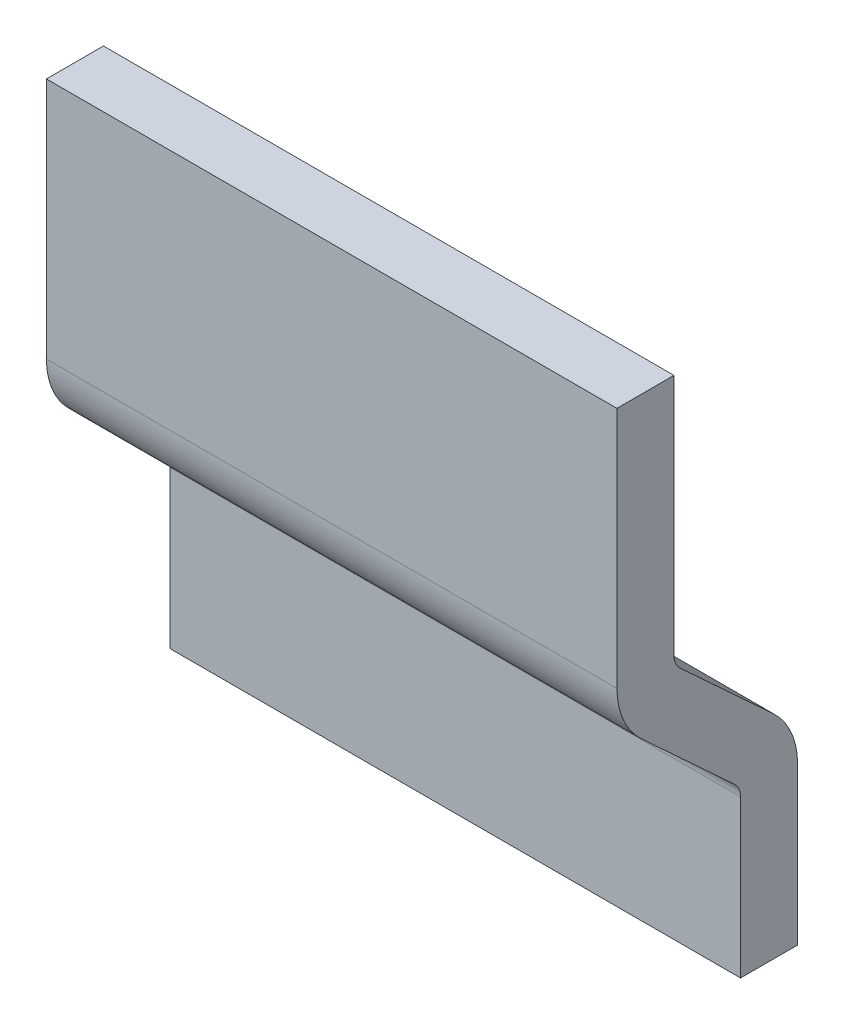
ISO-10303-21;
HEADER;
FILE_DESCRIPTION(('STEP AP214'),'2;1');
FILE_NAME('part.step','',(''),(''),'','','');
FILE_SCHEMA(('AUTOMOTIVE_DESIGN { 1 0 10303 214 1 1 1 1 }'));
ENDSEC;
DATA;
#1=APPLICATION_CONTEXT('core data for automotive mechanical design processes');
#2=APPLICATION_PROTOCOL_DEFINITION('international standard','automotive_design',2000,#1);
#3=PRODUCT_CONTEXT('',#1,'mechanical');
#4=PRODUCT('Part','Part','',(#3));
#5=PRODUCT_RELATED_PRODUCT_CATEGORY('part','',(#4));
#6=PRODUCT_DEFINITION_FORMATION('','',#4);
#7=PRODUCT_DEFINITION_CONTEXT('part definition',#1,'design');
#8=PRODUCT_DEFINITION('design','',#6,#7);
#9=PRODUCT_DEFINITION_SHAPE('','',#8);
#10=(LENGTH_UNIT() NAMED_UNIT(*) SI_UNIT(.MILLI.,.METRE.));
#11=(NAMED_UNIT(*) PLANE_ANGLE_UNIT() SI_UNIT($,.RADIAN.));
#12=(NAMED_UNIT(*) SI_UNIT($,.STERADIAN.) SOLID_ANGLE_UNIT());
#13=UNCERTAINTY_MEASURE_WITH_UNIT(LENGTH_MEASURE(1.E-05),#10,'distance_accuracy_value','');
#14=(GEOMETRIC_REPRESENTATION_CONTEXT(3) GLOBAL_UNCERTAINTY_ASSIGNED_CONTEXT((#13)) GLOBAL_UNIT_ASSIGNED_CONTEXT((#10,
#11,#12)) REPRESENTATION_CONTEXT('',''));
#15=CARTESIAN_POINT('',(0.,0.,0.));
#16=DIRECTION('',(0.,0.,1.));
#17=DIRECTION('',(1.,0.,0.));
#18=AXIS2_PLACEMENT_3D('',#15,#16,#17);
#19=CARTESIAN_POINT('',(-1.5,-3.5,0.3));
#20=DIRECTION('',(0.,0.,1.));
#21=DIRECTION('',(0.,-1.,0.));
#22=AXIS2_PLACEMENT_3D('',#19,#20,#21);
#23=PLANE('',#22);
#24=DIRECTION('',(0.,-1.,0.));
#25=VECTOR('',#24,1.);
#26=CARTESIAN_POINT('',(1.5,-3.5,0.3));
#27=LINE('',#26,#25);
#28=CARTESIAN_POINT('',(1.5,-3.5,0.3));
#29=VERTEX_POINT('',#28);
#30=CARTESIAN_POINT('',(1.5,-2.675132492706,0.3));
#31=VERTEX_POINT('',#30);
#32=EDGE_CURVE('E102',#29,#31,#27,.F.);
#33=ORIENTED_EDGE('',*,*,#32,.T.);
#34=DIRECTION('',(1.,0.,0.));
#35=VECTOR('',#34,1.);
#36=CARTESIAN_POINT('',(-1.5,-2.675132492706,0.3));
#37=LINE('',#36,#35);
#38=CARTESIAN_POINT('',(-1.5,-2.675132492706,0.3));
#39=VERTEX_POINT('',#38);
#40=EDGE_CURVE('E106',#31,#39,#37,.F.);
#41=ORIENTED_EDGE('',*,*,#40,.T.);
#42=DIRECTION('',(0.,-1.,0.));
#43=VECTOR('',#42,1.);
#44=CARTESIAN_POINT('',(-1.5,-3.5,0.3));
#45=LINE('',#44,#43);
#46=CARTESIAN_POINT('',(-1.5,-3.5,0.3));
#47=VERTEX_POINT('',#46);
#48=EDGE_CURVE('E90',#39,#47,#45,.T.);
#49=ORIENTED_EDGE('',*,*,#48,.T.);
#50=DIRECTION('',(1.,0.,0.));
#51=VECTOR('',#50,1.);
#52=CARTESIAN_POINT('',(-1.5,-3.5,0.3));
#53=LINE('',#52,#51);
#54=EDGE_CURVE('E162',#29,#47,#53,.F.);
#55=ORIENTED_EDGE('',*,*,#54,.F.);
#56=EDGE_LOOP('',(#33,#41,#49,#55));
#57=FACE_BOUND('',#56,.T.);
#58=ADVANCED_FACE('F17',(#57),#23,.T.);
#59=CARTESIAN_POINT('',(-1.5,-2.675132492706,0.4));
#60=DIRECTION('',(1.,0.,0.));
#61=DIRECTION('',(0.,1.,0.));
#62=AXIS2_PLACEMENT_3D('',#59,#60,#61);
#63=CYLINDRICAL_SURFACE('',#62,0.1);
#64=CARTESIAN_POINT('',(1.5,-2.675132492706,0.4));
#65=DIRECTION('',(1.,0.,0.));
#66=DIRECTION('',(0.,1.,0.));
#67=AXIS2_PLACEMENT_3D('',#64,#65,#66);
#68=CIRCLE('',#67,0.1);
#69=CARTESIAN_POINT('',(1.5,-2.60165214824366,0.332171989726855));
#70=VERTEX_POINT('',#69);
#71=EDGE_CURVE('E110',#70,#31,#68,.F.);
#72=ORIENTED_EDGE('',*,*,#71,.F.);
#73=DIRECTION('',(1.,0.,0.));
#74=VECTOR('',#73,1.);
#75=CARTESIAN_POINT('',(-1.5,-2.60165214824374,0.332171989726762));
#76=LINE('',#75,#74);
#77=CARTESIAN_POINT('',(-1.5,-2.60165214824366,0.332171989726855));
#78=VERTEX_POINT('',#77);
#79=EDGE_CURVE('E114',#78,#70,#76,.T.);
#80=ORIENTED_EDGE('',*,*,#79,.F.);
#81=CARTESIAN_POINT('',(-1.5,-2.675132492706,0.4));
#82=DIRECTION('',(1.,0.,0.));
#83=DIRECTION('',(0.,1.,0.));
#84=AXIS2_PLACEMENT_3D('',#81,#82,#83);
#85=CIRCLE('',#84,0.1);
#86=EDGE_CURVE('E20',#39,#78,#85,.T.);
#87=ORIENTED_EDGE('',*,*,#86,.F.);
#88=ORIENTED_EDGE('',*,*,#40,.F.);
#89=EDGE_LOOP('',(#72,#80,#87,#88));
#90=FACE_BOUND('',#89,.T.);
#91=ADVANCED_FACE('F112',(#90),#63,.F.);
#92=CARTESIAN_POINT('',(-1.5,-3.5,0.));
#93=DIRECTION('',(0.,-1.,0.));
#94=DIRECTION('',(1.,0.,0.));
#95=AXIS2_PLACEMENT_3D('',#92,#93,#94);
#96=PLANE('',#95);
#97=ORIENTED_EDGE('',*,*,#54,.T.);
#98=DIRECTION('',(0.,0.,1.));
#99=VECTOR('',#98,1.);
#100=CARTESIAN_POINT('',(-1.5,-3.5,0.));
#101=LINE('',#100,#99);
#102=CARTESIAN_POINT('',(-1.5,-3.5,0.));
#103=VERTEX_POINT('',#102);
#104=EDGE_CURVE('E98',#47,#103,#101,.F.);
#105=ORIENTED_EDGE('',*,*,#104,.T.);
#106=DIRECTION('',(1.,0.,0.));
#107=VECTOR('',#106,1.);
#108=CARTESIAN_POINT('',(-1.5,-3.5,0.));
#109=LINE('',#108,#107);
#110=CARTESIAN_POINT('',(1.5,-3.5,0.));
#111=VERTEX_POINT('',#110);
#112=EDGE_CURVE('E141',#111,#103,#109,.F.);
#113=ORIENTED_EDGE('',*,*,#112,.F.);
#114=DIRECTION('',(0.,0.,1.));
#115=VECTOR('',#114,1.);
#116=CARTESIAN_POINT('',(1.5,-3.5,0.));
#117=LINE('',#116,#115);
#118=EDGE_CURVE('E109',#111,#29,#117,.T.);
#119=ORIENTED_EDGE('',*,*,#118,.T.);
#120=EDGE_LOOP('',(#97,#105,#113,#119));
#121=FACE_BOUND('',#120,.T.);
#122=ADVANCED_FACE('F173',(#121),#96,.T.);
#123=CARTESIAN_POINT('',(-1.5,-2.63134936953,0.3));
#124=DIRECTION('',(0.,-0.734803444627296,0.678280102733274));
#125=DIRECTION('',(0.,-0.678280102733274,-0.734803444627296));
#126=AXIS2_PLACEMENT_3D('',#123,#124,#125);
#127=PLANE('',#126);
#128=DIRECTION('',(0.,-0.678280102733274,-0.734803444627296));
#129=VECTOR('',#128,1.);
#130=CARTESIAN_POINT('',(1.5,-2.63134936953,0.3));
#131=LINE('',#130,#129);
#132=CARTESIAN_POINT('',(1.5,-2.15013825467414,0.821312041093317));
#133=VERTEX_POINT('',#132);
#134=EDGE_CURVE('E169',#70,#133,#131,.F.);
#135=ORIENTED_EDGE('',*,*,#134,.T.);
#136=DIRECTION('',(1.,0.,0.));
#137=VECTOR('',#136,1.);
#138=CARTESIAN_POINT('',(-1.5,-2.15013825467411,0.821312041093102));
#139=LINE('',#138,#137);
#140=CARTESIAN_POINT('',(-1.5,-2.15013825467414,0.821312041093317));
#141=VERTEX_POINT('',#140);
#142=EDGE_CURVE('E138',#141,#133,#139,.T.);
#143=ORIENTED_EDGE('',*,*,#142,.F.);
#144=DIRECTION('',(0.,-0.678280102733274,-0.734803444627296));
#145=VECTOR('',#144,1.);
#146=CARTESIAN_POINT('',(-1.5,-2.63134936953,0.3));
#147=LINE('',#146,#145);
#148=EDGE_CURVE('E156',#141,#78,#147,.T.);
#149=ORIENTED_EDGE('',*,*,#148,.T.);
#150=ORIENTED_EDGE('',*,*,#79,.T.);
#151=EDGE_LOOP('',(#135,#143,#149,#150));
#152=FACE_BOUND('',#151,.T.);
#153=ADVANCED_FACE('F240',(#152),#127,.T.);
#154=CARTESIAN_POINT('',(-1.5,-2.5,0.));
#155=DIRECTION('',(0.,0.,-1.));
#156=DIRECTION('',(0.,1.,0.));
#157=AXIS2_PLACEMENT_3D('',#154,#155,#156);
#158=PLANE('',#157);
#159=DIRECTION('',(0.,1.,0.));
#160=VECTOR('',#159,1.);
#161=CARTESIAN_POINT('',(1.5,-2.5,0.));
#162=LINE('',#161,#160);
#163=CARTESIAN_POINT('',(1.5,-2.675132492706,0.));
#164=VERTEX_POINT('',#163);
#165=EDGE_CURVE('E147',#164,#111,#162,.F.);
#166=ORIENTED_EDGE('',*,*,#165,.T.);
#167=ORIENTED_EDGE('',*,*,#112,.T.);
#168=DIRECTION('',(0.,1.,0.));
#169=VECTOR('',#168,1.);
#170=CARTESIAN_POINT('',(-1.5,-2.5,0.));
#171=LINE('',#170,#169);
#172=CARTESIAN_POINT('',(-1.5,-2.675132492706,0.));
#173=VERTEX_POINT('',#172);
#174=EDGE_CURVE('E152',#103,#173,#171,.T.);
#175=ORIENTED_EDGE('',*,*,#174,.T.);
#176=DIRECTION('',(1.,0.,0.));
#177=VECTOR('',#176,1.);
#178=CARTESIAN_POINT('',(-1.5,-2.675132492706,0.));
#179=LINE('',#178,#177);
#180=EDGE_CURVE('E132',#164,#173,#179,.F.);
#181=ORIENTED_EDGE('',*,*,#180,.F.);
#182=EDGE_LOOP('',(#166,#167,#175,#181));
#183=FACE_BOUND('',#182,.T.);
#184=ADVANCED_FACE('F246',(#183),#158,.T.);
#185=CARTESIAN_POINT('',(-1.5,-1.856216876823,0.55));
#186=DIRECTION('',(1.,0.,0.));
#187=DIRECTION('',(0.,1.,0.));
#188=AXIS2_PLACEMENT_3D('',#185,#186,#187);
#189=CYLINDRICAL_SURFACE('',#188,0.4);
#190=CARTESIAN_POINT('',(1.5,-1.856216876823,0.55));
#191=DIRECTION('',(1.,0.,0.));
#192=DIRECTION('',(0.,1.,0.));
#193=AXIS2_PLACEMENT_3D('',#190,#191,#192);
#194=CIRCLE('',#193,0.4);
#195=CARTESIAN_POINT('',(1.5,-1.856216876823,0.95));
#196=VERTEX_POINT('',#195);
#197=EDGE_CURVE('E136',#133,#196,#194,.F.);
#198=ORIENTED_EDGE('',*,*,#197,.T.);
#199=DIRECTION('',(1.,0.,0.));
#200=VECTOR('',#199,1.);
#201=CARTESIAN_POINT('',(-1.5,-1.856216876823,0.95));
#202=LINE('',#201,#200);
#203=CARTESIAN_POINT('',(-1.5,-1.856216876823,0.95));
#204=VERTEX_POINT('',#203);
#205=EDGE_CURVE('E131',#204,#196,#202,.T.);
#206=ORIENTED_EDGE('',*,*,#205,.F.);
#207=CARTESIAN_POINT('',(-1.5,-1.856216876823,0.55));
#208=DIRECTION('',(1.,0.,0.));
#209=DIRECTION('',(0.,1.,0.));
#210=AXIS2_PLACEMENT_3D('',#207,#208,#209);
#211=CIRCLE('',#210,0.4);
#212=EDGE_CURVE('E139',#204,#141,#211,.T.);
#213=ORIENTED_EDGE('',*,*,#212,.T.);
#214=ORIENTED_EDGE('',*,*,#142,.T.);
#215=EDGE_LOOP('',(#198,#206,#213,#214));
#216=FACE_BOUND('',#215,.T.);
#217=ADVANCED_FACE('F243',(#216),#189,.T.);
#218=CARTESIAN_POINT('',(-1.5,-2.675132492706,0.4));
#219=DIRECTION('',(1.,0.,0.));
#220=DIRECTION('',(0.,1.,0.));
#221=AXIS2_PLACEMENT_3D('',#218,#219,#220);
#222=CYLINDRICAL_SURFACE('',#221,0.4);
#223=ORIENTED_EDGE('',*,*,#180,.T.);
#224=CARTESIAN_POINT('',(-1.5,-2.675132492706,0.4));
#225=DIRECTION('',(1.,0.,0.));
#226=DIRECTION('',(0.,1.,0.));
#227=AXIS2_PLACEMENT_3D('',#224,#225,#226);
#228=CIRCLE('',#227,0.4);
#229=CARTESIAN_POINT('',(-1.5,-2.38121111485521,0.128687958906962));
#230=VERTEX_POINT('',#229);
#231=EDGE_CURVE('E129',#173,#230,#228,.T.);
#232=ORIENTED_EDGE('',*,*,#231,.T.);
#233=DIRECTION('',(1.,0.,0.));
#234=VECTOR('',#233,1.);
#235=CARTESIAN_POINT('',(-1.5,-2.38121111485519,0.128687958907174));
#236=LINE('',#235,#234);
#237=CARTESIAN_POINT('',(1.5,-2.38121111485521,0.128687958906962));
#238=VERTEX_POINT('',#237);
#239=EDGE_CURVE('E216',#238,#230,#236,.F.);
#240=ORIENTED_EDGE('',*,*,#239,.F.);
#241=CARTESIAN_POINT('',(1.5,-2.675132492706,0.4));
#242=DIRECTION('',(1.,0.,0.));
#243=DIRECTION('',(0.,1.,0.));
#244=AXIS2_PLACEMENT_3D('',#241,#242,#243);
#245=CIRCLE('',#244,0.4);
#246=EDGE_CURVE('E133',#238,#164,#245,.F.);
#247=ORIENTED_EDGE('',*,*,#246,.T.);
#248=EDGE_LOOP('',(#223,#232,#240,#247));
#249=FACE_BOUND('',#248,.T.);
#250=ADVANCED_FACE('F245',(#249),#222,.T.);
#251=CARTESIAN_POINT('',(-1.5,-2.03134936953,0.95));
#252=DIRECTION('',(0.,0.,1.));
#253=DIRECTION('',(0.,-1.,0.));
#254=AXIS2_PLACEMENT_3D('',#251,#252,#253);
#255=PLANE('',#254);
#256=DIRECTION('',(0.,-1.,0.));
#257=VECTOR('',#256,1.);
#258=CARTESIAN_POINT('',(1.5,-2.03134936953,0.95));
#259=LINE('',#258,#257);
#260=CARTESIAN_POINT('',(1.5,-0.580679000001,0.95));
#261=VERTEX_POINT('',#260);
#262=EDGE_CURVE('E224',#196,#261,#259,.F.);
#263=ORIENTED_EDGE('',*,*,#262,.T.);
#264=DIRECTION('',(-1.,0.,0.));
#265=VECTOR('',#264,1.);
#266=CARTESIAN_POINT('',(-1.5,-0.580679000001,0.95));
#267=LINE('',#266,#265);
#268=CARTESIAN_POINT('',(-1.5,-0.580679000001,0.95));
#269=VERTEX_POINT('',#268);
#270=EDGE_CURVE('E195',#269,#261,#267,.F.);
#271=ORIENTED_EDGE('',*,*,#270,.F.);
#272=DIRECTION('',(0.,1.,0.));
#273=VECTOR('',#272,1.);
#274=CARTESIAN_POINT('',(-1.5,-2.058641392508,0.95));
#275=LINE('',#274,#273);
#276=EDGE_CURVE('E191',#269,#204,#275,.F.);
#277=ORIENTED_EDGE('',*,*,#276,.T.);
#278=ORIENTED_EDGE('',*,*,#205,.T.);
#279=EDGE_LOOP('',(#263,#271,#277,#278));
#280=FACE_BOUND('',#279,.T.);
#281=ADVANCED_FACE('F253',(#280),#255,.T.);
#282=CARTESIAN_POINT('',(-1.5,-1.9,0.65));
#283=DIRECTION('',(0.,0.734803444627296,-0.678280102733274));
#284=DIRECTION('',(0.,0.678280102733274,0.734803444627296));
#285=AXIS2_PLACEMENT_3D('',#282,#283,#284);
#286=PLANE('',#285);
#287=DIRECTION('',(0.,0.678280102733378,0.7348034446272));
#288=VECTOR('',#287,1.);
#289=CARTESIAN_POINT('',(1.5,-2.381211114855,0.128687958907));
#290=LINE('',#289,#288);
#291=CARTESIAN_POINT('',(1.5,-1.92969722128586,0.617828010273169));
#292=VERTEX_POINT('',#291);
#293=EDGE_CURVE('E194',#238,#292,#290,.T.);
#294=ORIENTED_EDGE('',*,*,#293,.F.);
#295=ORIENTED_EDGE('',*,*,#239,.T.);
#296=DIRECTION('',(0.,0.678280102733378,0.7348034446272));
#297=VECTOR('',#296,1.);
#298=CARTESIAN_POINT('',(-1.5,-2.381211114855,0.128687958907));
#299=LINE('',#298,#297);
#300=CARTESIAN_POINT('',(-1.5,-1.92969722128586,0.617828010273169));
#301=VERTEX_POINT('',#300);
#302=EDGE_CURVE('E212',#230,#301,#299,.T.);
#303=ORIENTED_EDGE('',*,*,#302,.T.);
#304=DIRECTION('',(1.,0.,0.));
#305=VECTOR('',#304,1.);
#306=CARTESIAN_POINT('',(-1.5,-1.92969722128602,0.617828010273016));
#307=LINE('',#306,#305);
#308=EDGE_CURVE('E124',#301,#292,#307,.T.);
#309=ORIENTED_EDGE('',*,*,#308,.T.);
#310=EDGE_LOOP('',(#294,#295,#303,#309));
#311=FACE_BOUND('',#310,.T.);
#312=ADVANCED_FACE('F272',(#311),#286,.T.);
#313=CARTESIAN_POINT('',(-1.5,-2.058641392508,0.516801249384));
#314=DIRECTION('',(1.,0.,0.));
#315=DIRECTION('',(0.,1.,0.));
#316=AXIS2_PLACEMENT_3D('',#313,#314,#315);
#317=PLANE('',#316);
#318=ORIENTED_EDGE('',*,*,#174,.F.);
#319=ORIENTED_EDGE('',*,*,#104,.F.);
#320=ORIENTED_EDGE('',*,*,#48,.F.);
#321=ORIENTED_EDGE('',*,*,#86,.T.);
#322=ORIENTED_EDGE('',*,*,#148,.F.);
#323=ORIENTED_EDGE('',*,*,#212,.F.);
#324=ORIENTED_EDGE('',*,*,#276,.F.);
#325=DIRECTION('',(0.,0.,1.));
#326=VECTOR('',#325,1.);
#327=CARTESIAN_POINT('',(-1.5,-0.580679000001,0.95));
#328=LINE('',#327,#326);
#329=CARTESIAN_POINT('',(-1.5,-0.580679000001,0.65));
#330=VERTEX_POINT('',#329);
#331=EDGE_CURVE('E186',#330,#269,#328,.T.);
#332=ORIENTED_EDGE('',*,*,#331,.F.);
#333=DIRECTION('',(0.,1.,0.));
#334=VECTOR('',#333,1.);
#335=CARTESIAN_POINT('',(-1.5,-0.580679000001,0.65));
#336=LINE('',#335,#334);
#337=CARTESIAN_POINT('',(-1.5,-1.856216876823,0.65));
#338=VERTEX_POINT('',#337);
#339=EDGE_CURVE('E123',#338,#330,#336,.T.);
#340=ORIENTED_EDGE('',*,*,#339,.F.);
#341=CARTESIAN_POINT('',(-1.5,-1.856216876823,0.55));
#342=DIRECTION('',(1.,0.,0.));
#343=DIRECTION('',(0.,1.,0.));
#344=AXIS2_PLACEMENT_3D('',#341,#342,#343);
#345=CIRCLE('',#344,0.1);
#346=EDGE_CURVE('E125',#338,#301,#345,.T.);
#347=ORIENTED_EDGE('',*,*,#346,.T.);
#348=ORIENTED_EDGE('',*,*,#302,.F.);
#349=ORIENTED_EDGE('',*,*,#231,.F.);
#350=EDGE_LOOP('',(#318,#319,#320,#321,#322,#323,#324,#332,#340,#347,#348,#349));
#351=FACE_BOUND('',#350,.T.);
#352=ADVANCED_FACE('F93',(#351),#317,.F.);
#353=CARTESIAN_POINT('',(-1.5,-0.580679000001,0.95));
#354=DIRECTION('',(0.,1.,0.));
#355=DIRECTION('',(-1.,0.,0.));
#356=AXIS2_PLACEMENT_3D('',#353,#354,#355);
#357=PLANE('',#356);
#358=DIRECTION('',(1.,0.,0.));
#359=VECTOR('',#358,1.);
#360=CARTESIAN_POINT('',(-1.5,-0.580679000001,0.65));
#361=LINE('',#360,#359);
#362=CARTESIAN_POINT('',(1.5,-0.580679000001,0.65));
#363=VERTEX_POINT('',#362);
#364=EDGE_CURVE('E198',#330,#363,#361,.T.);
#365=ORIENTED_EDGE('',*,*,#364,.F.);
#366=ORIENTED_EDGE('',*,*,#331,.T.);
#367=ORIENTED_EDGE('',*,*,#270,.T.);
#368=DIRECTION('',(0.,0.,1.));
#369=VECTOR('',#368,1.);
#370=CARTESIAN_POINT('',(1.5,-0.580679000001,0.516801249384));
#371=LINE('',#370,#369);
#372=EDGE_CURVE('E128',#363,#261,#371,.T.);
#373=ORIENTED_EDGE('',*,*,#372,.F.);
#374=EDGE_LOOP('',(#365,#366,#367,#373));
#375=FACE_BOUND('',#374,.T.);
#376=ADVANCED_FACE('F199',(#375),#357,.T.);
#377=CARTESIAN_POINT('',(1.5,-2.058641392508,0.516801249384));
#378=DIRECTION('',(1.,0.,0.));
#379=DIRECTION('',(0.,1.,0.));
#380=AXIS2_PLACEMENT_3D('',#377,#378,#379);
#381=PLANE('',#380);
#382=ORIENTED_EDGE('',*,*,#165,.F.);
#383=ORIENTED_EDGE('',*,*,#246,.F.);
#384=ORIENTED_EDGE('',*,*,#293,.T.);
#385=CARTESIAN_POINT('',(1.5,-1.856216876823,0.55));
#386=DIRECTION('',(1.,0.,0.));
#387=DIRECTION('',(0.,1.,0.));
#388=AXIS2_PLACEMENT_3D('',#385,#386,#387);
#389=CIRCLE('',#388,0.1);
#390=CARTESIAN_POINT('',(1.5,-1.856216876823,0.650000000000001));
#391=VERTEX_POINT('',#390);
#392=EDGE_CURVE('E35',#292,#391,#389,.F.);
#393=ORIENTED_EDGE('',*,*,#392,.T.);
#394=DIRECTION('',(0.,1.,0.));
#395=VECTOR('',#394,1.);
#396=CARTESIAN_POINT('',(1.5,-0.580679000001,0.65));
#397=LINE('',#396,#395);
#398=EDGE_CURVE('E26',#363,#391,#397,.F.);
#399=ORIENTED_EDGE('',*,*,#398,.F.);
#400=ORIENTED_EDGE('',*,*,#372,.T.);
#401=ORIENTED_EDGE('',*,*,#262,.F.);
#402=ORIENTED_EDGE('',*,*,#197,.F.);
#403=ORIENTED_EDGE('',*,*,#134,.F.);
#404=ORIENTED_EDGE('',*,*,#71,.T.);
#405=ORIENTED_EDGE('',*,*,#32,.F.);
#406=ORIENTED_EDGE('',*,*,#118,.F.);
#407=EDGE_LOOP('',(#382,#383,#384,#393,#399,#400,#401,#402,#403,#404,#405,#406));
#408=FACE_BOUND('',#407,.T.);
#409=ADVANCED_FACE('F242',(#408),#381,.T.);
#410=CARTESIAN_POINT('',(-1.5,-1.856216876823,0.55));
#411=DIRECTION('',(1.,0.,0.));
#412=DIRECTION('',(0.,1.,0.));
#413=AXIS2_PLACEMENT_3D('',#410,#411,#412);
#414=CYLINDRICAL_SURFACE('',#413,0.1);
#415=ORIENTED_EDGE('',*,*,#392,.F.);
#416=ORIENTED_EDGE('',*,*,#308,.F.);
#417=ORIENTED_EDGE('',*,*,#346,.F.);
#418=DIRECTION('',(1.,0.,0.));
#419=VECTOR('',#418,1.);
#420=CARTESIAN_POINT('',(-1.5,-1.856216876823,0.65));
#421=LINE('',#420,#419);
#422=EDGE_CURVE('E11',#391,#338,#421,.F.);
#423=ORIENTED_EDGE('',*,*,#422,.F.);
#424=EDGE_LOOP('',(#415,#416,#417,#423));
#425=FACE_BOUND('',#424,.T.);
#426=ADVANCED_FACE('F258',(#425),#414,.F.);
#427=CARTESIAN_POINT('',(-1.5,-0.580679000001,0.65));
#428=DIRECTION('',(0.,0.,-1.));
#429=DIRECTION('',(0.,1.,0.));
#430=AXIS2_PLACEMENT_3D('',#427,#428,#429);
#431=PLANE('',#430);
#432=ORIENTED_EDGE('',*,*,#398,.T.);
#433=ORIENTED_EDGE('',*,*,#422,.T.);
#434=ORIENTED_EDGE('',*,*,#339,.T.);
#435=ORIENTED_EDGE('',*,*,#364,.T.);
#436=EDGE_LOOP('',(#432,#433,#434,#435));
#437=FACE_BOUND('',#436,.T.);
#438=ADVANCED_FACE('F204',(#437),#431,.T.);
#439=CLOSED_SHELL('',(#58,#91,#122,#153,#184,#217,#250,#281,#312,#352,#376,#409,#426,#438));
#440=MANIFOLD_SOLID_BREP('B1',#439);
#441=ADVANCED_BREP_SHAPE_REPRESENTATION('',(#18,#440),#14);
#442=SHAPE_DEFINITION_REPRESENTATION(#9,#441);
ENDSEC;
END-ISO-10303-21;
